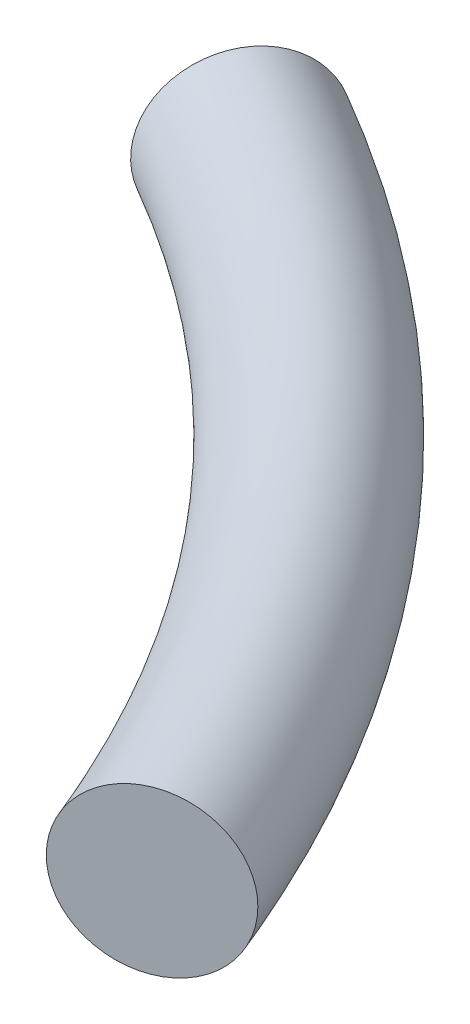
ISO-10303-21;
HEADER;
FILE_DESCRIPTION(('STEP AP214'),'2;1');
FILE_NAME('part.step','',(''),(''),'','','');
FILE_SCHEMA(('AUTOMOTIVE_DESIGN { 1 0 10303 214 1 1 1 1 }'));
ENDSEC;
DATA;
#1=APPLICATION_CONTEXT('core data for automotive mechanical design processes');
#2=APPLICATION_PROTOCOL_DEFINITION('international standard','automotive_design',2000,#1);
#3=PRODUCT_CONTEXT('',#1,'mechanical');
#4=PRODUCT('Part','Part','',(#3));
#5=PRODUCT_RELATED_PRODUCT_CATEGORY('part','',(#4));
#6=PRODUCT_DEFINITION_FORMATION('','',#4);
#7=PRODUCT_DEFINITION_CONTEXT('part definition',#1,'design');
#8=PRODUCT_DEFINITION('design','',#6,#7);
#9=PRODUCT_DEFINITION_SHAPE('','',#8);
#10=(LENGTH_UNIT() NAMED_UNIT(*) SI_UNIT(.MILLI.,.METRE.));
#11=(NAMED_UNIT(*) PLANE_ANGLE_UNIT() SI_UNIT($,.RADIAN.));
#12=(NAMED_UNIT(*) SI_UNIT($,.STERADIAN.) SOLID_ANGLE_UNIT());
#13=UNCERTAINTY_MEASURE_WITH_UNIT(LENGTH_MEASURE(1.E-05),#10,'distance_accuracy_value','');
#14=(GEOMETRIC_REPRESENTATION_CONTEXT(3) GLOBAL_UNCERTAINTY_ASSIGNED_CONTEXT((#13)) GLOBAL_UNIT_ASSIGNED_CONTEXT((#10,
#11,#12)) REPRESENTATION_CONTEXT('',''));
#15=CARTESIAN_POINT('',(0.,0.,0.));
#16=DIRECTION('',(0.,0.,1.));
#17=DIRECTION('',(1.,0.,0.));
#18=AXIS2_PLACEMENT_3D('',#15,#16,#17);
#19=CARTESIAN_POINT('',(0.,6.,0.));
#20=DIRECTION('',(-0.866025403784429,0.,-0.500000000000017));
#21=DIRECTION('',(-0.500000000000017,0.,0.866025403784429));
#22=AXIS2_PLACEMENT_3D('',#19,#20,#21);
#23=PLANE('',#22);
#24=CARTESIAN_POINT('',(3.63108791023412,0.7302,-6.28922874727432));
#25=CARTESIAN_POINT('',(3.63108698739497,0.75265524155964,-6.28922714887002));
#26=CARTESIAN_POINT('',(3.63013898641127,0.775130857259379,-6.28758516300063));
#27=CARTESIAN_POINT('',(3.62636753079511,0.819482451297505,-6.28105281025495));
#28=CARTESIAN_POINT('',(3.62354006226909,0.841357041711004,-6.27615549111107));
#29=CARTESIAN_POINT('',(3.61609390767631,0.883809618347233,-6.26325837303537));
#30=CARTESIAN_POINT('',(3.61147841861812,0.904389843003348,-6.25526411148481));
#31=CARTESIAN_POINT('',(3.60057867993472,0.943737337222424,-6.23638521029594));
#32=CARTESIAN_POINT('',(3.59429206298594,0.962501982989582,-6.22549647033293));
#33=CARTESIAN_POINT('',(3.58024190927052,0.997627484938171,-6.20116089024368));
#34=CARTESIAN_POINT('',(3.5724804675519,1.01399169330263,-6.18771767884702));
#35=CARTESIAN_POINT('',(3.55568305940641,1.0439048849067,-6.15862371450357));
#36=CARTESIAN_POINT('',(3.54664532398077,1.05744989503907,-6.142969897561));
#37=CARTESIAN_POINT('',(3.52756751307787,1.08130194187445,-6.10992615977998));
#38=CARTESIAN_POINT('',(3.51752817245899,1.0916113298001,-6.09253751175359));
#39=CARTESIAN_POINT('',(3.49672597599199,1.10871348302438,-6.05650705056373));
#40=CARTESIAN_POINT('',(3.48596307762102,1.11550604143746,-6.0378651637485));
#41=CARTESIAN_POINT('',(3.46402017754947,1.12538061292917,-5.99985894595918));
#42=CARTESIAN_POINT('',(3.45284018812463,1.12846273512374,-5.98049463624727));
#43=CARTESIAN_POINT('',(3.43038017063847,1.1308293161772,-5.94159274482236));
#44=CARTESIAN_POINT('',(3.41910014257715,1.13011377503607,-5.92205516310936));
#45=CARTESIAN_POINT('',(3.39675992136801,1.12490525493437,-5.88336076492279));
#46=CARTESIAN_POINT('',(3.38569973469516,1.12041216488209,-5.86420395966422));
#47=CARTESIAN_POINT('',(3.36411417608541,1.10777635092602,-5.82681667544238));
#48=CARTESIAN_POINT('',(3.3535887727305,1.09963384169881,-5.80858614206153));
#49=CARTESIAN_POINT('',(3.33336342447937,1.07992311451522,-5.77355481128979));
#50=CARTESIAN_POINT('',(3.32366408684375,1.06835240391896,-5.75675506570514));
#51=CARTESIAN_POINT('',(3.30538807390379,1.04213485030234,-5.72510008273334));
#52=CARTESIAN_POINT('',(3.29680984813471,1.02749233015651,-5.7102421598625));
#53=CARTESIAN_POINT('',(3.28099203420321,0.99551397474831,-5.68284490246848));
#54=CARTESIAN_POINT('',(3.27375435337223,0.97817436557765,-5.67030887154025));
#55=CARTESIAN_POINT('',(3.26084769700023,0.941335318357767,-5.6479538869481));
#56=CARTESIAN_POINT('',(3.25517650509116,0.921838987081608,-5.63813109442213));
#57=CARTESIAN_POINT('',(3.24554117777032,0.881186262625342,-5.62144221795487));
#58=CARTESIAN_POINT('',(3.24158010406486,0.8600269715397,-5.6145814370445));
#59=CARTESIAN_POINT('',(3.23549936143523,0.81671349003598,-5.60404928186222));
#60=CARTESIAN_POINT('',(3.2333757737575,0.794561523394871,-5.60037112011007));
#61=CARTESIAN_POINT('',(3.23145693740612,0.758269762147004,-5.59704759805807));
#62=CARTESIAN_POINT('',(3.23108733328141,0.744238862857464,-5.59640742493538));
#63=CARTESIAN_POINT('',(3.23108883307326,0.70774475844036,-5.59641002265107));
#64=CARTESIAN_POINT('',(3.23203683405696,0.685269142740621,-5.59805200852046));
#65=CARTESIAN_POINT('',(3.23580828967312,0.640917548702496,-5.60458436126614));
#66=CARTESIAN_POINT('',(3.23863575819914,0.619042958288997,-5.60948168041002));
#67=CARTESIAN_POINT('',(3.24608191279192,0.576590381652767,-5.62237879848572));
#68=CARTESIAN_POINT('',(3.25069740185011,0.556010156996652,-5.63037306003628));
#69=CARTESIAN_POINT('',(3.26159714053351,0.516662662777576,-5.64925196122515));
#70=CARTESIAN_POINT('',(3.26788375748229,0.497898017010418,-5.66014070118816));
#71=CARTESIAN_POINT('',(3.28193391119771,0.46277251506183,-5.68447628127741));
#72=CARTESIAN_POINT('',(3.28969535291633,0.44640830669737,-5.69791949267407));
#73=CARTESIAN_POINT('',(3.30649276106182,0.416495115093301,-5.72701345701752));
#74=CARTESIAN_POINT('',(3.31553049648746,0.40295010496093,-5.74266727396009));
#75=CARTESIAN_POINT('',(3.33460830739036,0.379098058125552,-5.77571101174111));
#76=CARTESIAN_POINT('',(3.34464764800924,0.368788670199896,-5.7930996597675));
#77=CARTESIAN_POINT('',(3.36544984447624,0.351686516975622,-5.82913012095736));
#78=CARTESIAN_POINT('',(3.37621274284721,0.344893958562538,-5.84777200777259));
#79=CARTESIAN_POINT('',(3.39815564291876,0.335019387070832,-5.8857782255619));
#80=CARTESIAN_POINT('',(3.4093356323436,0.331937264876257,-5.90514253527382));
#81=CARTESIAN_POINT('',(3.43179564982976,0.329570683822803,-5.94404442669873));
#82=CARTESIAN_POINT('',(3.44307567789108,0.330286224963925,-5.96358200841173));
#83=CARTESIAN_POINT('',(3.46541589910022,0.335494745065634,-6.00227640659829));
#84=CARTESIAN_POINT('',(3.47647608577307,0.339987835117909,-6.02143321185687));
#85=CARTESIAN_POINT('',(3.49806164438282,0.352623649073977,-6.05882049607871));
#86=CARTESIAN_POINT('',(3.50858704773773,0.360766158301187,-6.07705102945956));
#87=CARTESIAN_POINT('',(3.52881239598886,0.380476885484782,-6.1120823602313));
#88=CARTESIAN_POINT('',(3.53851173362448,0.392047596081044,-6.12888210581595));
#89=CARTESIAN_POINT('',(3.55678774656444,0.418265149697663,-6.16053708878774));
#90=CARTESIAN_POINT('',(3.56536597233352,0.432907669843493,-6.17539501165859));
#91=CARTESIAN_POINT('',(3.58118378626502,0.464886025251689,-6.20279226905261));
#92=CARTESIAN_POINT('',(3.588421467096,0.482225634422349,-6.21532829998084));
#93=CARTESIAN_POINT('',(3.601328123468,0.519064681642232,-6.23768328457299));
#94=CARTESIAN_POINT('',(3.60699931537707,0.538561012918392,-6.24750607709896));
#95=CARTESIAN_POINT('',(3.61663464269791,0.579213737374657,-6.26419495356621));
#96=CARTESIAN_POINT('',(3.62059571640337,0.600373028460299,-6.27105573447659));
#97=CARTESIAN_POINT('',(3.626676459033,0.64368650996402,-6.28158788965887));
#98=CARTESIAN_POINT('',(3.62880004671073,0.665838476605128,-6.28526605141102));
#99=CARTESIAN_POINT('',(3.63071888306211,0.702130237852995,-6.28858957346302));
#100=CARTESIAN_POINT('',(3.63108848718682,0.716161137142536,-6.28922974658571));
#101=CARTESIAN_POINT('',(3.63108791023412,0.7302,-6.28922874727432));
#102=B_SPLINE_CURVE_WITH_KNOTS('',3,(#24,#25,#26,#27,#28,#29,#30,#31,#32,#33,#34,#35,#36,#37,
#38,#39,#40,#41,#42,#43,#44,#45,#46,#47,#48,#49,#50,#51,#52,#53,#54,#55,#56,#57,#58,#59,#60,#61,
#62,#63,#64,#65,#66,#67,#68,#69,#70,#71,#72,#73,#74,#75,#76,#77,#78,#79,#80,#81,#82,#83,#84,#85,
#86,#87,#88,#89,#90,#91,#92,#93,#94,#95,#96,#97,#98,#99,#100,#101),.UNSPECIFIED.,.T.,.F.,(4,2,2,
2,2,2,2,2,2,2,2,2,2,2,2,2,2,2,2,2,2,2,2,2,2,2,2,2,2,2,2,2,2,2,2,2,2,2,4),(0.,0.0673217190940754,
0.134787678055461,0.202133559490899,0.269575356418626,0.336922056232695,0.40436303479347,
0.471754892083667,0.539150713403566,0.606544552708822,0.67393839201408,0.741334213333977,
0.808726070624174,0.876167049184948,0.943513748999018,1.01095554592846,1.07830142736561,
1.14576738632871,1.2130891054245,1.25517818200736,1.32249990110144,1.38996586006282,
1.45731174149826,1.52475353842599,1.59210023824006,1.65954121680083,1.72693307409103,
1.79432889541093,1.86172273471618,1.92911657402144,1.99651239534134,2.06390425263154,
2.13134523119231,2.19869193100638,2.26613372793582,2.33347960937297,2.40094556833608,
2.46826728743186,2.51035636401472),.UNSPECIFIED.);
#103=CARTESIAN_POINT('',(3.63108791023412,0.7302,-6.28922874727432));
#104=VERTEX_POINT('',#103);
#105=EDGE_CURVE('E18',#104,#104,#102,.T.);
#106=ORIENTED_EDGE('',*,*,#105,.F.);
#107=EDGE_LOOP('',(#106));
#108=FACE_BOUND('',#107,.T.);
#109=ADVANCED_FACE('F14',(#108),#23,.T.);
#110=CARTESIAN_POINT('',(0.,6.,0.));
#111=DIRECTION('',(-0.374606593415897,0.,-0.927183854566793));
#112=DIRECTION('',(-0.927183854566793,0.,0.374606593415897));
#113=AXIS2_PLACEMENT_3D('',#110,#111,#112);
#114=PLANE('',#113);
#115=CARTESIAN_POINT('',(5.99162508610985,0.730199999999999,-2.4207736701601));
#116=CARTESIAN_POINT('',(5.99162679739297,0.752655241559639,-2.42077436156336));
#117=CARTESIAN_POINT('',(5.99338473980537,0.775130857259378,-2.42148461640147));
#118=CARTESIAN_POINT('',(6.00037840531641,0.819482451297504,-2.42431024068266));
#119=CARTESIAN_POINT('',(6.00562157164966,0.841357041711003,-2.42642861738771));
#120=CARTESIAN_POINT('',(6.01942948028372,0.883809618347232,-2.4320073745998));
#121=CARTESIAN_POINT('',(6.02798829415509,0.904389843003348,-2.43546535986587));
#122=CARTESIAN_POINT('',(6.04820041760758,0.943737337222423,-2.4436315878205));
#123=CARTESIAN_POINT('',(6.05985811707709,0.962501982989581,-2.44834160413909));
#124=CARTESIAN_POINT('',(6.08591226843532,0.99762748493817,-2.45886816457969));
#125=CARTESIAN_POINT('',(6.10030483533466,1.01399169330263,-2.46468313906411));
#126=CARTESIAN_POINT('',(6.1314534065968,1.0439048849067,-2.47726797875131));
#127=CARTESIAN_POINT('',(6.14821269133379,1.05744989503907,-2.48403916931129));
#128=CARTESIAN_POINT('',(6.18358996783309,1.08130194187445,-2.49833251681563));
#129=CARTESIAN_POINT('',(6.20220659689773,1.0916113298001,-2.50585412319439));
#130=CARTESIAN_POINT('',(6.24078151830517,1.10871348302438,-2.52143940310252));
#131=CARTESIAN_POINT('',(6.260739889501,1.11550604143746,-2.52950310849059));
#132=CARTESIAN_POINT('',(6.30143009483841,1.12538061292917,-2.54594301858152));
#133=CARTESIAN_POINT('',(6.3221619062163,1.12846273512374,-2.55431921408726));
#134=CARTESIAN_POINT('',(6.36381103738921,1.1308293161772,-2.57114655536436));
#135=CARTESIAN_POINT('',(6.38472835718423,1.13011377503607,-2.57959770113573));
#136=CARTESIAN_POINT('',(6.42615534200937,1.12490525493437,-2.59633528946236));
#137=CARTESIAN_POINT('',(6.44666499503249,1.12041216488209,-2.60462172716648));
#138=CARTESIAN_POINT('',(6.48669255790202,1.10777635092602,-2.62079391232203));
#139=CARTESIAN_POINT('',(6.50621052600897,1.09963384169881,-2.62867968331225));
#140=CARTESIAN_POINT('',(6.54371575871185,1.07992311451522,-2.64383278093027));
#141=CARTESIAN_POINT('',(6.56170189722332,1.06835240391896,-2.65109965259041));
#142=CARTESIAN_POINT('',(6.59559234547089,1.04213485030234,-2.66479228248773));
#143=CARTESIAN_POINT('',(6.61149953033872,1.02749233015651,-2.67121920235354));
#144=CARTESIAN_POINT('',(6.64083157372238,0.995513974748311,-2.68307011713787));
#145=CARTESIAN_POINT('',(6.65425289534437,0.978174365577651,-2.68849268305853));
#146=CARTESIAN_POINT('',(6.6781865821535,0.941335318357768,-2.69816252021034));
#147=CARTESIAN_POINT('',(6.68870305730196,0.921838987081608,-2.70241145197366));
#148=CARTESIAN_POINT('',(6.70657049715267,0.881186262625343,-2.70963036626187));
#149=CARTESIAN_POINT('',(6.71391578432557,0.860026971539701,-2.71259805491602));
#150=CARTESIAN_POINT('',(6.72519171710552,0.81671349003598,-2.71715382747988));
#151=CARTESIAN_POINT('',(6.72912962952261,0.794561523394872,-2.71874484737142));
#152=CARTESIAN_POINT('',(6.73268785769171,0.758269762147005,-2.72018246486924));
#153=CARTESIAN_POINT('',(6.73337323964574,0.744238862857464,-2.72045937715339));
#154=CARTESIAN_POINT('',(6.73337045848016,0.707744758440359,-2.72045825348956));
#155=CARTESIAN_POINT('',(6.73161251606777,0.68526914274062,-2.71974799865144));
#156=CARTESIAN_POINT('',(6.72461885055673,0.640917548702494,-2.71692237437026));
#157=CARTESIAN_POINT('',(6.71937568422348,0.619042958288996,-2.71480399766521));
#158=CARTESIAN_POINT('',(6.70556777558942,0.576590381652766,-2.70922524045312));
#159=CARTESIAN_POINT('',(6.69700896171805,0.556010156996651,-2.70576725518704));
#160=CARTESIAN_POINT('',(6.67679683826556,0.516662662777575,-2.69760102723242));
#161=CARTESIAN_POINT('',(6.66513913879605,0.497898017010418,-2.69289101091383));
#162=CARTESIAN_POINT('',(6.63908498743782,0.462772515061829,-2.68236445047323));
#163=CARTESIAN_POINT('',(6.62469242053847,0.446408306697369,-2.6765494759888));
#164=CARTESIAN_POINT('',(6.59354384927634,0.416495115093301,-2.66396463630161));
#165=CARTESIAN_POINT('',(6.57678456453934,0.402950104960929,-2.65719344574162));
#166=CARTESIAN_POINT('',(6.54140728804005,0.379098058125551,-2.64290009823729));
#167=CARTESIAN_POINT('',(6.5227906589754,0.368788670199895,-2.63537849185853));
#168=CARTESIAN_POINT('',(6.48421573756796,0.351686516975622,-2.61979321195039));
#169=CARTESIAN_POINT('',(6.46425736637213,0.344893958562538,-2.61172950656232));
#170=CARTESIAN_POINT('',(6.42356716103472,0.335019387070832,-2.59528959647139));
#171=CARTESIAN_POINT('',(6.40283534965683,0.331937264876257,-2.58691340096566));
#172=CARTESIAN_POINT('',(6.36118621848392,0.329570683822803,-2.57008605968856));
#173=CARTESIAN_POINT('',(6.3402688986889,0.330286224963925,-2.56163491391719));
#174=CARTESIAN_POINT('',(6.29884191386377,0.335494745065634,-2.54489732559056));
#175=CARTESIAN_POINT('',(6.27833226084064,0.339987835117909,-2.53661088788644));
#176=CARTESIAN_POINT('',(6.23830469797112,0.352623649073977,-2.52043870273088));
#177=CARTESIAN_POINT('',(6.21878672986417,0.360766158301187,-2.51255293174066));
#178=CARTESIAN_POINT('',(6.18128149716129,0.380476885484782,-2.49739983412265));
#179=CARTESIAN_POINT('',(6.16329535864981,0.392047596081044,-2.49013296246251));
#180=CARTESIAN_POINT('',(6.12940491040225,0.418265149697664,-2.47644033256519));
#181=CARTESIAN_POINT('',(6.11349772553441,0.432907669843494,-2.47001341269937));
#182=CARTESIAN_POINT('',(6.08416568215076,0.464886025251691,-2.45816249791504));
#183=CARTESIAN_POINT('',(6.07074436052877,0.48222563442235,-2.45273993199439));
#184=CARTESIAN_POINT('',(6.04681067371964,0.519064681642233,-2.44307009484258));
#185=CARTESIAN_POINT('',(6.03629419857117,0.538561012918392,-2.43882116307925));
#186=CARTESIAN_POINT('',(6.01842675872047,0.579213737374658,-2.43160224879104));
#187=CARTESIAN_POINT('',(6.01108147154757,0.6003730284603,-2.42863456013689));
#188=CARTESIAN_POINT('',(5.99980553876762,0.64368650996402,-2.42407878757304));
#189=CARTESIAN_POINT('',(5.99586762635052,0.665838476605129,-2.42248776768149));
#190=CARTESIAN_POINT('',(5.99230939818142,0.702130237852996,-2.42105015018367));
#191=CARTESIAN_POINT('',(5.99162401622739,0.716161137142536,-2.42077323789953));
#192=CARTESIAN_POINT('',(5.99162508610985,0.730199999999999,-2.4207736701601));
#193=B_SPLINE_CURVE_WITH_KNOTS('',3,(#115,#116,#117,#118,#119,#120,#121,#122,#123,#124,#125,
#126,#127,#128,#129,#130,#131,#132,#133,#134,#135,#136,#137,#138,#139,#140,#141,#142,#143,#144,
#145,#146,#147,#148,#149,#150,#151,#152,#153,#154,#155,#156,#157,#158,#159,#160,#161,#162,#163,
#164,#165,#166,#167,#168,#169,#170,#171,#172,#173,#174,#175,#176,#177,#178,#179,#180,#181,#182,
#183,#184,#185,#186,#187,#188,#189,#190,#191,#192),.UNSPECIFIED.,.T.,.F.,(4,2,2,2,2,2,2,2,2,2,2,
2,2,2,2,2,2,2,2,2,2,2,2,2,2,2,2,2,2,2,2,2,2,2,2,2,2,2,4),(0.,0.0673217190940753,
0.134787678055461,0.202133559490899,0.269575356418626,0.336922056232695,0.40436303479347,
0.471754892083668,0.539150713403565,0.606544552708822,0.673938392014079,0.741334213333978,
0.808726070624175,0.876167049184949,0.943513748999018,1.01095554592846,1.07830142736561,
1.14576738632871,1.2130891054245,1.25517818200736,1.32249990110144,1.38996586006282,
1.45731174149826,1.52475353842599,1.59210023824006,1.65954121680083,1.72693307409103,
1.79432889541093,1.86172273471619,1.92911657402144,1.99651239534134,2.06390425263154,
2.13134523119231,2.19869193100638,2.26613372793582,2.33347960937297,2.40094556833608,
2.46826728743186,2.51035636401472),.UNSPECIFIED.);
#194=CARTESIAN_POINT('',(5.99162508610985,0.730199999999999,-2.4207736701601));
#195=VERTEX_POINT('',#194);
#196=EDGE_CURVE('E10',#195,#195,#193,.T.);
#197=ORIENTED_EDGE('',*,*,#196,.F.);
#198=EDGE_LOOP('',(#197));
#199=FACE_BOUND('',#198,.T.);
#200=ADVANCED_FACE('F34',(#199),#114,.F.);
#201=CARTESIAN_POINT('',(0.,0.7302,0.));
#202=DIRECTION('',(0.,-1.,0.));
#203=DIRECTION('',(-0.866025403784429,0.,-0.500000000000017));
#204=AXIS2_PLACEMENT_3D('',#201,#202,#203);
#205=TOROIDAL_SURFACE('',#204,6.862175820468,0.4);
#206=ORIENTED_EDGE('',*,*,#196,.T.);
#207=EDGE_LOOP('',(#206));
#208=FACE_BOUND('',#207,.T.);
#209=ORIENTED_EDGE('',*,*,#105,.T.);
#210=EDGE_LOOP('',(#209));
#211=FACE_BOUND('',#210,.T.);
#212=ADVANCED_FACE('F36',(#208,#211),#205,.T.);
#213=CLOSED_SHELL('',(#109,#200,#212));
#214=MANIFOLD_SOLID_BREP('B1',#213);
#215=ADVANCED_BREP_SHAPE_REPRESENTATION('',(#18,#214),#14);
#216=SHAPE_DEFINITION_REPRESENTATION(#9,#215);
ENDSEC;
END-ISO-10303-21;
